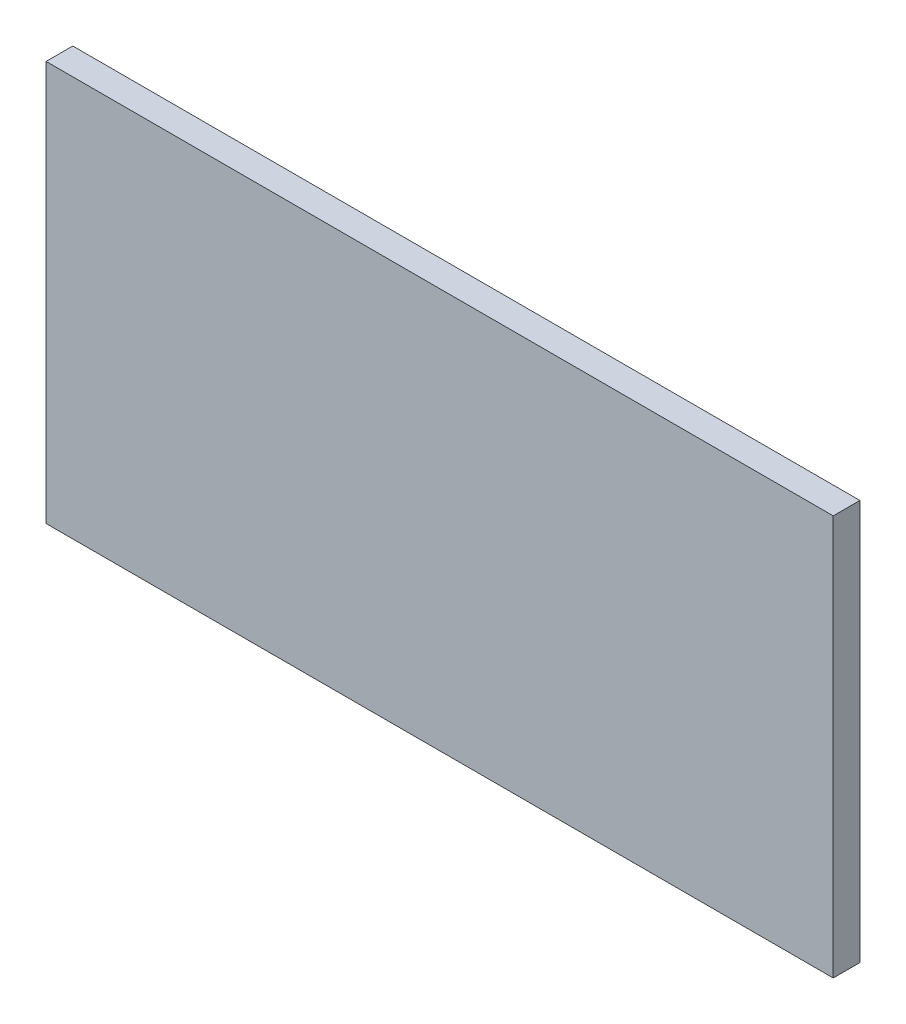
ISO-10303-21;
HEADER;
FILE_DESCRIPTION(('STEP AP214'),'2;1');
FILE_NAME('part.step','',(''),(''),'','','');
FILE_SCHEMA(('AUTOMOTIVE_DESIGN { 1 0 10303 214 1 1 1 1 }'));
ENDSEC;
DATA;
#1=APPLICATION_CONTEXT('core data for automotive mechanical design processes');
#2=APPLICATION_PROTOCOL_DEFINITION('international standard','automotive_design',2000,#1);
#3=PRODUCT_CONTEXT('',#1,'mechanical');
#4=PRODUCT('Part','Part','',(#3));
#5=PRODUCT_RELATED_PRODUCT_CATEGORY('part','',(#4));
#6=PRODUCT_DEFINITION_FORMATION('','',#4);
#7=PRODUCT_DEFINITION_CONTEXT('part definition',#1,'design');
#8=PRODUCT_DEFINITION('design','',#6,#7);
#9=PRODUCT_DEFINITION_SHAPE('','',#8);
#10=(LENGTH_UNIT() NAMED_UNIT(*) SI_UNIT(.MILLI.,.METRE.));
#11=(NAMED_UNIT(*) PLANE_ANGLE_UNIT() SI_UNIT($,.RADIAN.));
#12=(NAMED_UNIT(*) SI_UNIT($,.STERADIAN.) SOLID_ANGLE_UNIT());
#13=UNCERTAINTY_MEASURE_WITH_UNIT(LENGTH_MEASURE(1.E-05),#10,'distance_accuracy_value','');
#14=(GEOMETRIC_REPRESENTATION_CONTEXT(3) GLOBAL_UNCERTAINTY_ASSIGNED_CONTEXT((#13)) GLOBAL_UNIT_ASSIGNED_CONTEXT((#10,
#11,#12)) REPRESENTATION_CONTEXT('',''));
#15=CARTESIAN_POINT('',(0.,0.,0.));
#16=DIRECTION('',(0.,0.,1.));
#17=DIRECTION('',(1.,0.,0.));
#18=AXIS2_PLACEMENT_3D('',#15,#16,#17);
#19=CARTESIAN_POINT('',(29.5,-15.,2.));
#20=DIRECTION('',(-1.,0.,0.));
#21=DIRECTION('',(0.,0.,1.));
#22=AXIS2_PLACEMENT_3D('',#19,#20,#21);
#23=PLANE('',#22);
#24=DIRECTION('',(0.,1.,0.));
#25=VECTOR('',#24,1.);
#26=CARTESIAN_POINT('',(29.5,-15.,0.));
#27=LINE('',#26,#25);
#28=CARTESIAN_POINT('',(29.5,-15.,0.));
#29=VERTEX_POINT('',#28);
#30=CARTESIAN_POINT('',(29.5,15.,0.));
#31=VERTEX_POINT('',#30);
#32=EDGE_CURVE('E96',#29,#31,#27,.T.);
#33=ORIENTED_EDGE('',*,*,#32,.T.);
#34=DIRECTION('',(0.,0.,-1.));
#35=VECTOR('',#34,1.);
#36=CARTESIAN_POINT('',(29.5,15.,2.));
#37=LINE('',#36,#35);
#38=CARTESIAN_POINT('',(29.5,15.,2.));
#39=VERTEX_POINT('',#38);
#40=EDGE_CURVE('E11',#39,#31,#37,.T.);
#41=ORIENTED_EDGE('',*,*,#40,.F.);
#42=DIRECTION('',(0.,1.,0.));
#43=VECTOR('',#42,1.);
#44=CARTESIAN_POINT('',(29.5,-15.,2.));
#45=LINE('',#44,#43);
#46=CARTESIAN_POINT('',(29.5,-15.,2.));
#47=VERTEX_POINT('',#46);
#48=EDGE_CURVE('E84',#47,#39,#45,.T.);
#49=ORIENTED_EDGE('',*,*,#48,.F.);
#50=DIRECTION('',(0.,0.,-1.));
#51=VECTOR('',#50,1.);
#52=CARTESIAN_POINT('',(29.5,-15.,2.));
#53=LINE('',#52,#51);
#54=EDGE_CURVE('E92',#47,#29,#53,.T.);
#55=ORIENTED_EDGE('',*,*,#54,.T.);
#56=EDGE_LOOP('',(#33,#41,#49,#55));
#57=FACE_BOUND('',#56,.T.);
#58=ADVANCED_FACE('F33',(#57),#23,.F.);
#59=CARTESIAN_POINT('',(-29.5,15.,2.));
#60=DIRECTION('',(0.,-1.,0.));
#61=DIRECTION('',(0.,0.,-1.));
#62=AXIS2_PLACEMENT_3D('',#59,#60,#61);
#63=PLANE('',#62);
#64=DIRECTION('',(-1.,0.,0.));
#65=VECTOR('',#64,1.);
#66=CARTESIAN_POINT('',(-29.5,15.,0.));
#67=LINE('',#66,#65);
#68=CARTESIAN_POINT('',(-29.5,15.,0.));
#69=VERTEX_POINT('',#68);
#70=EDGE_CURVE('E88',#31,#69,#67,.T.);
#71=ORIENTED_EDGE('',*,*,#70,.T.);
#72=DIRECTION('',(0.,0.,-1.));
#73=VECTOR('',#72,1.);
#74=CARTESIAN_POINT('',(-29.5,15.,2.));
#75=LINE('',#74,#73);
#76=CARTESIAN_POINT('',(-29.5,15.,2.));
#77=VERTEX_POINT('',#76);
#78=EDGE_CURVE('E41',#77,#69,#75,.T.);
#79=ORIENTED_EDGE('',*,*,#78,.F.);
#80=DIRECTION('',(-1.,0.,0.));
#81=VECTOR('',#80,1.);
#82=CARTESIAN_POINT('',(-29.5,15.,2.));
#83=LINE('',#82,#81);
#84=EDGE_CURVE('E79',#39,#77,#83,.T.);
#85=ORIENTED_EDGE('',*,*,#84,.F.);
#86=ORIENTED_EDGE('',*,*,#40,.T.);
#87=EDGE_LOOP('',(#71,#79,#85,#86));
#88=FACE_BOUND('',#87,.T.);
#89=ADVANCED_FACE('F87',(#88),#63,.F.);
#90=CARTESIAN_POINT('',(-29.5,-15.,2.));
#91=DIRECTION('',(1.,0.,0.));
#92=DIRECTION('',(0.,0.,-1.));
#93=AXIS2_PLACEMENT_3D('',#90,#91,#92);
#94=PLANE('',#93);
#95=DIRECTION('',(0.,-1.,0.));
#96=VECTOR('',#95,1.);
#97=CARTESIAN_POINT('',(-29.5,-15.,0.));
#98=LINE('',#97,#96);
#99=CARTESIAN_POINT('',(-29.5,-15.,0.));
#100=VERTEX_POINT('',#99);
#101=EDGE_CURVE('E66',#69,#100,#98,.T.);
#102=ORIENTED_EDGE('',*,*,#101,.T.);
#103=DIRECTION('',(0.,0.,-1.));
#104=VECTOR('',#103,1.);
#105=CARTESIAN_POINT('',(-29.5,-15.,2.));
#106=LINE('',#105,#104);
#107=CARTESIAN_POINT('',(-29.5,-15.,2.));
#108=VERTEX_POINT('',#107);
#109=EDGE_CURVE('E89',#108,#100,#106,.T.);
#110=ORIENTED_EDGE('',*,*,#109,.F.);
#111=DIRECTION('',(0.,-1.,0.));
#112=VECTOR('',#111,1.);
#113=CARTESIAN_POINT('',(-29.5,-15.,2.));
#114=LINE('',#113,#112);
#115=EDGE_CURVE('E82',#77,#108,#114,.T.);
#116=ORIENTED_EDGE('',*,*,#115,.F.);
#117=ORIENTED_EDGE('',*,*,#78,.T.);
#118=EDGE_LOOP('',(#102,#110,#116,#117));
#119=FACE_BOUND('',#118,.T.);
#120=ADVANCED_FACE('F90',(#119),#94,.F.);
#121=CARTESIAN_POINT('',(-29.5,-15.,2.));
#122=DIRECTION('',(0.,1.,0.));
#123=DIRECTION('',(0.,0.,1.));
#124=AXIS2_PLACEMENT_3D('',#121,#122,#123);
#125=PLANE('',#124);
#126=DIRECTION('',(1.,0.,0.));
#127=VECTOR('',#126,1.);
#128=CARTESIAN_POINT('',(-29.5,-15.,0.));
#129=LINE('',#128,#127);
#130=EDGE_CURVE('E72',#100,#29,#129,.T.);
#131=ORIENTED_EDGE('',*,*,#130,.T.);
#132=ORIENTED_EDGE('',*,*,#54,.F.);
#133=DIRECTION('',(1.,0.,0.));
#134=VECTOR('',#133,1.);
#135=CARTESIAN_POINT('',(-29.5,-15.,2.));
#136=LINE('',#135,#134);
#137=EDGE_CURVE('E49',#108,#47,#136,.T.);
#138=ORIENTED_EDGE('',*,*,#137,.F.);
#139=ORIENTED_EDGE('',*,*,#109,.T.);
#140=EDGE_LOOP('',(#131,#132,#138,#139));
#141=FACE_BOUND('',#140,.T.);
#142=ADVANCED_FACE('F103',(#141),#125,.F.);
#143=CARTESIAN_POINT('',(0.,0.,2.));
#144=DIRECTION('',(0.,0.,-1.));
#145=DIRECTION('',(-1.,0.,0.));
#146=AXIS2_PLACEMENT_3D('',#143,#144,#145);
#147=PLANE('',#146);
#148=ORIENTED_EDGE('',*,*,#48,.T.);
#149=ORIENTED_EDGE('',*,*,#84,.T.);
#150=ORIENTED_EDGE('',*,*,#115,.T.);
#151=ORIENTED_EDGE('',*,*,#137,.T.);
#152=EDGE_LOOP('',(#148,#149,#150,#151));
#153=FACE_BOUND('',#152,.T.);
#154=ADVANCED_FACE('F80',(#153),#147,.F.);
#155=CARTESIAN_POINT('',(0.,0.,0.));
#156=DIRECTION('',(0.,0.,-1.));
#157=DIRECTION('',(-1.,0.,0.));
#158=AXIS2_PLACEMENT_3D('',#155,#156,#157);
#159=PLANE('',#158);
#160=ORIENTED_EDGE('',*,*,#32,.F.);
#161=ORIENTED_EDGE('',*,*,#130,.F.);
#162=ORIENTED_EDGE('',*,*,#101,.F.);
#163=ORIENTED_EDGE('',*,*,#70,.F.);
#164=EDGE_LOOP('',(#160,#161,#162,#163));
#165=FACE_BOUND('',#164,.T.);
#166=ADVANCED_FACE('F106',(#165),#159,.T.);
#167=CLOSED_SHELL('',(#58,#89,#120,#142,#154,#166));
#168=MANIFOLD_SOLID_BREP('B2',#167);
#169=ADVANCED_BREP_SHAPE_REPRESENTATION('',(#18,#168),#14);
#170=SHAPE_DEFINITION_REPRESENTATION(#9,#169);
ENDSEC;
END-ISO-10303-21;
